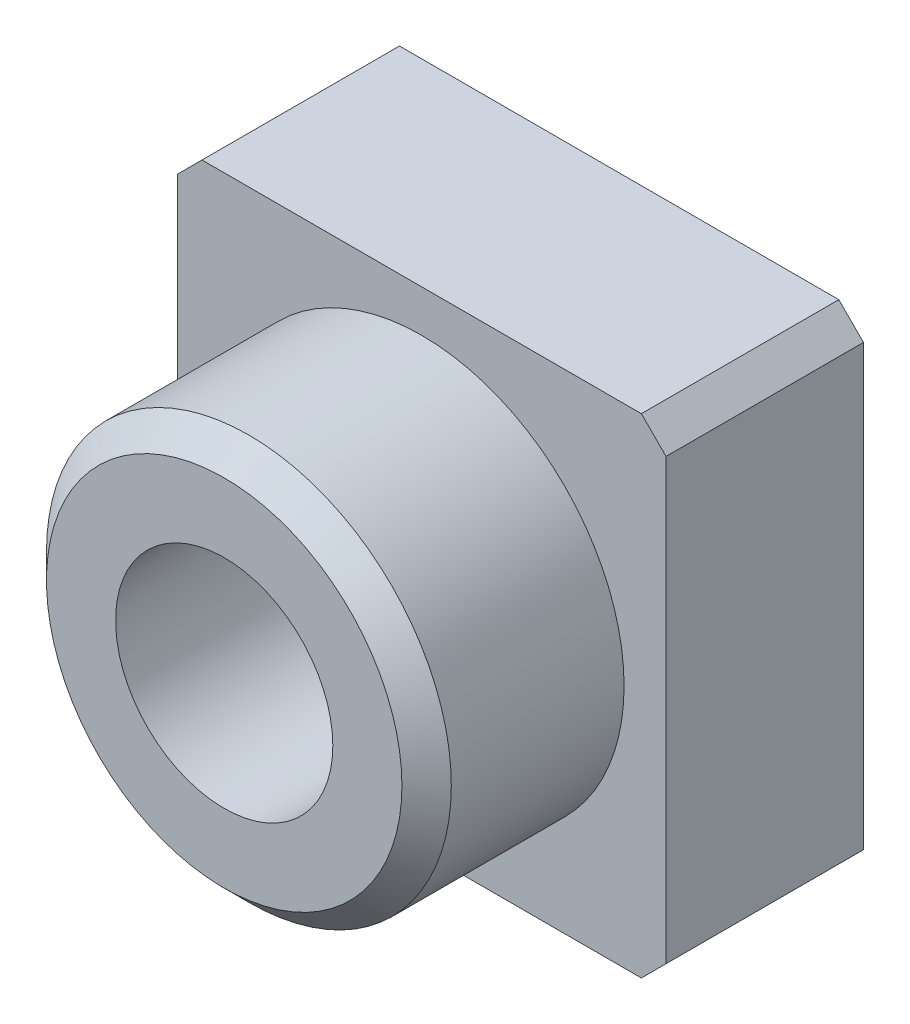
ISO-10303-21;
HEADER;
FILE_DESCRIPTION(('STEP AP214'),'2;1');
FILE_NAME('part.step','',(''),(''),'','','');
FILE_SCHEMA(('AUTOMOTIVE_DESIGN { 1 0 10303 214 1 1 1 1 }'));
ENDSEC;
DATA;
#1=APPLICATION_CONTEXT('core data for automotive mechanical design processes');
#2=APPLICATION_PROTOCOL_DEFINITION('international standard','automotive_design',2000,#1);
#3=PRODUCT_CONTEXT('',#1,'mechanical');
#4=PRODUCT('Part','Part','',(#3));
#5=PRODUCT_RELATED_PRODUCT_CATEGORY('part','',(#4));
#6=PRODUCT_DEFINITION_FORMATION('','',#4);
#7=PRODUCT_DEFINITION_CONTEXT('part definition',#1,'design');
#8=PRODUCT_DEFINITION('design','',#6,#7);
#9=PRODUCT_DEFINITION_SHAPE('','',#8);
#10=(LENGTH_UNIT() NAMED_UNIT(*) SI_UNIT(.MILLI.,.METRE.));
#11=(NAMED_UNIT(*) PLANE_ANGLE_UNIT() SI_UNIT($,.RADIAN.));
#12=(NAMED_UNIT(*) SI_UNIT($,.STERADIAN.) SOLID_ANGLE_UNIT());
#13=UNCERTAINTY_MEASURE_WITH_UNIT(LENGTH_MEASURE(1.E-05),#10,'distance_accuracy_value','');
#14=(GEOMETRIC_REPRESENTATION_CONTEXT(3) GLOBAL_UNCERTAINTY_ASSIGNED_CONTEXT((#13)) GLOBAL_UNIT_ASSIGNED_CONTEXT((#10,
#11,#12)) REPRESENTATION_CONTEXT('',''));
#15=CARTESIAN_POINT('',(0.,0.,0.));
#16=DIRECTION('',(0.,0.,1.));
#17=DIRECTION('',(1.,0.,0.));
#18=AXIS2_PLACEMENT_3D('',#15,#16,#17);
#19=CARTESIAN_POINT('',(0.,0.,0.));
#20=DIRECTION('',(0.,0.,-1.));
#21=DIRECTION('',(-1.,0.,0.));
#22=AXIS2_PLACEMENT_3D('',#19,#20,#21);
#23=PLANE('',#22);
#24=DIRECTION('',(0.,1.,0.));
#25=VECTOR('',#24,1.);
#26=CARTESIAN_POINT('',(4.95,-4.95,0.));
#27=LINE('',#26,#25);
#28=CARTESIAN_POINT('',(4.95,-4.45,0.));
#29=VERTEX_POINT('',#28);
#30=CARTESIAN_POINT('',(4.95,4.44999999999999,0.));
#31=VERTEX_POINT('',#30);
#32=EDGE_CURVE('E231',#29,#31,#27,.T.);
#33=ORIENTED_EDGE('',*,*,#32,.F.);
#34=DIRECTION('',(0.707106781186549,0.707106781186546,0.));
#35=VECTOR('',#34,1.);
#36=CARTESIAN_POINT('',(4.69999999999999,-4.70000000000001,0.));
#37=LINE('',#36,#35);
#38=CARTESIAN_POINT('',(4.44999999999999,-4.95,0.));
#39=VERTEX_POINT('',#38);
#40=EDGE_CURVE('E269',#29,#39,#37,.F.);
#41=ORIENTED_EDGE('',*,*,#40,.T.);
#42=DIRECTION('',(1.,0.,0.));
#43=VECTOR('',#42,1.);
#44=CARTESIAN_POINT('',(-4.95,-4.95,0.));
#45=LINE('',#44,#43);
#46=CARTESIAN_POINT('',(-4.45,-4.95,0.));
#47=VERTEX_POINT('',#46);
#48=EDGE_CURVE('E220',#47,#39,#45,.T.);
#49=ORIENTED_EDGE('',*,*,#48,.F.);
#50=DIRECTION('',(0.707106781186546,-0.707106781186549,0.));
#51=VECTOR('',#50,1.);
#52=CARTESIAN_POINT('',(-4.70000000000001,-4.69999999999999,0.));
#53=LINE('',#52,#51);
#54=CARTESIAN_POINT('',(-4.95,-4.45,0.));
#55=VERTEX_POINT('',#54);
#56=EDGE_CURVE('E263',#47,#55,#53,.F.);
#57=ORIENTED_EDGE('',*,*,#56,.T.);
#58=DIRECTION('',(0.,-1.,0.));
#59=VECTOR('',#58,1.);
#60=CARTESIAN_POINT('',(-4.95,-4.95,0.));
#61=LINE('',#60,#59);
#62=CARTESIAN_POINT('',(-4.95,4.44999999999999,0.));
#63=VERTEX_POINT('',#62);
#64=EDGE_CURVE('E240',#63,#55,#61,.T.);
#65=ORIENTED_EDGE('',*,*,#64,.F.);
#66=DIRECTION('',(-0.707106781186549,-0.707106781186546,0.));
#67=VECTOR('',#66,1.);
#68=CARTESIAN_POINT('',(-4.69999999999999,4.70000000000001,0.));
#69=LINE('',#68,#67);
#70=CARTESIAN_POINT('',(-4.45,4.95,0.));
#71=VERTEX_POINT('',#70);
#72=EDGE_CURVE('E260',#63,#71,#69,.F.);
#73=ORIENTED_EDGE('',*,*,#72,.T.);
#74=DIRECTION('',(-1.,0.,0.));
#75=VECTOR('',#74,1.);
#76=CARTESIAN_POINT('',(-4.95,4.95,0.));
#77=LINE('',#76,#75);
#78=CARTESIAN_POINT('',(4.44999999999999,4.95,0.));
#79=VERTEX_POINT('',#78);
#80=EDGE_CURVE('E235',#79,#71,#77,.T.);
#81=ORIENTED_EDGE('',*,*,#80,.F.);
#82=DIRECTION('',(-0.707106781186546,0.707106781186549,0.));
#83=VECTOR('',#82,1.);
#84=CARTESIAN_POINT('',(4.70000000000001,4.69999999999999,0.));
#85=LINE('',#84,#83);
#86=EDGE_CURVE('E266',#79,#31,#85,.F.);
#87=ORIENTED_EDGE('',*,*,#86,.T.);
#88=EDGE_LOOP('',(#33,#41,#49,#57,#65,#73,#81,#87));
#89=FACE_BOUND('',#88,.T.);
#90=DIRECTION('',(0.5,-0.866025403784439,0.));
#91=VECTOR('',#90,1.);
#92=CARTESIAN_POINT('',(-4.1569219381653,0.,0.));
#93=LINE('',#92,#91);
#94=CARTESIAN_POINT('',(-4.1569219381653,0.,0.));
#95=VERTEX_POINT('',#94);
#96=CARTESIAN_POINT('',(-2.07846096908265,-3.6,0.));
#97=VERTEX_POINT('',#96);
#98=EDGE_CURVE('E192',#95,#97,#93,.T.);
#99=ORIENTED_EDGE('',*,*,#98,.T.);
#100=DIRECTION('',(1.,0.,0.));
#101=VECTOR('',#100,1.);
#102=CARTESIAN_POINT('',(-2.07846096908265,-3.6,0.));
#103=LINE('',#102,#101);
#104=CARTESIAN_POINT('',(2.07846096908265,-3.6,0.));
#105=VERTEX_POINT('',#104);
#106=EDGE_CURVE('E195',#97,#105,#103,.T.);
#107=ORIENTED_EDGE('',*,*,#106,.T.);
#108=DIRECTION('',(0.5,0.866025403784438,0.));
#109=VECTOR('',#108,1.);
#110=CARTESIAN_POINT('',(2.07846096908265,-3.6,0.));
#111=LINE('',#110,#109);
#112=CARTESIAN_POINT('',(4.15692193816531,0.,0.));
#113=VERTEX_POINT('',#112);
#114=EDGE_CURVE('E180',#105,#113,#111,.T.);
#115=ORIENTED_EDGE('',*,*,#114,.T.);
#116=DIRECTION('',(-0.5,0.866025403784438,0.));
#117=VECTOR('',#116,1.);
#118=CARTESIAN_POINT('',(4.15692193816531,0.,0.));
#119=LINE('',#118,#117);
#120=CARTESIAN_POINT('',(2.07846096908265,3.6,0.));
#121=VERTEX_POINT('',#120);
#122=EDGE_CURVE('E156',#113,#121,#119,.T.);
#123=ORIENTED_EDGE('',*,*,#122,.T.);
#124=DIRECTION('',(-1.,0.,0.));
#125=VECTOR('',#124,1.);
#126=CARTESIAN_POINT('',(2.07846096908265,3.6,0.));
#127=LINE('',#126,#125);
#128=CARTESIAN_POINT('',(-2.07846096908265,3.6,0.));
#129=VERTEX_POINT('',#128);
#130=EDGE_CURVE('E167',#121,#129,#127,.T.);
#131=ORIENTED_EDGE('',*,*,#130,.T.);
#132=DIRECTION('',(-0.5,-0.866025403784439,0.));
#133=VECTOR('',#132,1.);
#134=CARTESIAN_POINT('',(-2.07846096908265,3.6,0.));
#135=LINE('',#134,#133);
#136=EDGE_CURVE('E174',#129,#95,#135,.T.);
#137=ORIENTED_EDGE('',*,*,#136,.T.);
#138=EDGE_LOOP('',(#99,#107,#115,#123,#131,#137));
#139=FACE_BOUND('',#138,.T.);
#140=ADVANCED_FACE('F49',(#89,#139),#23,.T.);
#141=CARTESIAN_POINT('',(4.95,-4.95,4.));
#142=DIRECTION('',(-1.,0.,0.));
#143=DIRECTION('',(0.,0.,1.));
#144=AXIS2_PLACEMENT_3D('',#141,#142,#143);
#145=PLANE('',#144);
#146=DIRECTION('',(0.,1.,0.));
#147=VECTOR('',#146,1.);
#148=CARTESIAN_POINT('',(4.95,-4.95,4.));
#149=LINE('',#148,#147);
#150=CARTESIAN_POINT('',(4.95,-4.45,4.));
#151=VERTEX_POINT('',#150);
#152=CARTESIAN_POINT('',(4.95,4.44999999999999,4.));
#153=VERTEX_POINT('',#152);
#154=EDGE_CURVE('E215',#151,#153,#149,.T.);
#155=ORIENTED_EDGE('',*,*,#154,.F.);
#156=DIRECTION('',(0.,0.,-1.));
#157=VECTOR('',#156,1.);
#158=CARTESIAN_POINT('',(4.95,-4.45,4.));
#159=LINE('',#158,#157);
#160=EDGE_CURVE('E256',#151,#29,#159,.T.);
#161=ORIENTED_EDGE('',*,*,#160,.T.);
#162=ORIENTED_EDGE('',*,*,#32,.T.);
#163=DIRECTION('',(0.,0.,1.));
#164=VECTOR('',#163,1.);
#165=CARTESIAN_POINT('',(4.95,4.45,4.));
#166=LINE('',#165,#164);
#167=EDGE_CURVE('E253',#31,#153,#166,.T.);
#168=ORIENTED_EDGE('',*,*,#167,.T.);
#169=EDGE_LOOP('',(#155,#161,#162,#168));
#170=FACE_BOUND('',#169,.T.);
#171=ADVANCED_FACE('F322',(#170),#145,.F.);
#172=CARTESIAN_POINT('',(-4.95,4.95,4.));
#173=DIRECTION('',(0.,-1.,0.));
#174=DIRECTION('',(0.,0.,-1.));
#175=AXIS2_PLACEMENT_3D('',#172,#173,#174);
#176=PLANE('',#175);
#177=DIRECTION('',(-1.,0.,0.));
#178=VECTOR('',#177,1.);
#179=CARTESIAN_POINT('',(-4.95,4.95,4.));
#180=LINE('',#179,#178);
#181=CARTESIAN_POINT('',(4.44999999999999,4.95,4.));
#182=VERTEX_POINT('',#181);
#183=CARTESIAN_POINT('',(-4.45,4.95,4.));
#184=VERTEX_POINT('',#183);
#185=EDGE_CURVE('E219',#182,#184,#180,.T.);
#186=ORIENTED_EDGE('',*,*,#185,.F.);
#187=DIRECTION('',(0.,0.,-1.));
#188=VECTOR('',#187,1.);
#189=CARTESIAN_POINT('',(4.45,4.95,4.));
#190=LINE('',#189,#188);
#191=EDGE_CURVE('E293',#182,#79,#190,.T.);
#192=ORIENTED_EDGE('',*,*,#191,.T.);
#193=ORIENTED_EDGE('',*,*,#80,.T.);
#194=DIRECTION('',(0.,0.,1.));
#195=VECTOR('',#194,1.);
#196=CARTESIAN_POINT('',(-4.45,4.95,4.));
#197=LINE('',#196,#195);
#198=EDGE_CURVE('E290',#71,#184,#197,.T.);
#199=ORIENTED_EDGE('',*,*,#198,.T.);
#200=EDGE_LOOP('',(#186,#192,#193,#199));
#201=FACE_BOUND('',#200,.T.);
#202=ADVANCED_FACE('F330',(#201),#176,.F.);
#203=CARTESIAN_POINT('',(-4.95,-4.95,4.));
#204=DIRECTION('',(1.,0.,0.));
#205=DIRECTION('',(0.,0.,-1.));
#206=AXIS2_PLACEMENT_3D('',#203,#204,#205);
#207=PLANE('',#206);
#208=ORIENTED_EDGE('',*,*,#64,.T.);
#209=DIRECTION('',(0.,0.,1.));
#210=VECTOR('',#209,1.);
#211=CARTESIAN_POINT('',(-4.95,-4.45,4.));
#212=LINE('',#211,#210);
#213=CARTESIAN_POINT('',(-4.95,-4.45,4.));
#214=VERTEX_POINT('',#213);
#215=EDGE_CURVE('E12',#55,#214,#212,.T.);
#216=ORIENTED_EDGE('',*,*,#215,.T.);
#217=DIRECTION('',(0.,-1.,0.));
#218=VECTOR('',#217,1.);
#219=CARTESIAN_POINT('',(-4.95,-4.95,4.));
#220=LINE('',#219,#218);
#221=CARTESIAN_POINT('',(-4.95,4.44999999999999,4.));
#222=VERTEX_POINT('',#221);
#223=EDGE_CURVE('E223',#222,#214,#220,.T.);
#224=ORIENTED_EDGE('',*,*,#223,.F.);
#225=DIRECTION('',(0.,0.,-1.));
#226=VECTOR('',#225,1.);
#227=CARTESIAN_POINT('',(-4.95,4.45,4.));
#228=LINE('',#227,#226);
#229=EDGE_CURVE('E59',#222,#63,#228,.T.);
#230=ORIENTED_EDGE('',*,*,#229,.T.);
#231=EDGE_LOOP('',(#208,#216,#224,#230));
#232=FACE_BOUND('',#231,.T.);
#233=ADVANCED_FACE('F301',(#232),#207,.F.);
#234=CARTESIAN_POINT('',(-4.95,-4.95,4.));
#235=DIRECTION('',(0.,1.,0.));
#236=DIRECTION('',(0.,0.,1.));
#237=AXIS2_PLACEMENT_3D('',#234,#235,#236);
#238=PLANE('',#237);
#239=ORIENTED_EDGE('',*,*,#48,.T.);
#240=DIRECTION('',(0.,0.,1.));
#241=VECTOR('',#240,1.);
#242=CARTESIAN_POINT('',(4.45,-4.95,4.));
#243=LINE('',#242,#241);
#244=CARTESIAN_POINT('',(4.44999999999999,-4.95,4.));
#245=VERTEX_POINT('',#244);
#246=EDGE_CURVE('E276',#39,#245,#243,.T.);
#247=ORIENTED_EDGE('',*,*,#246,.T.);
#248=DIRECTION('',(1.,0.,0.));
#249=VECTOR('',#248,1.);
#250=CARTESIAN_POINT('',(-4.95,-4.95,4.));
#251=LINE('',#250,#249);
#252=CARTESIAN_POINT('',(-4.45,-4.95,4.));
#253=VERTEX_POINT('',#252);
#254=EDGE_CURVE('E226',#253,#245,#251,.T.);
#255=ORIENTED_EDGE('',*,*,#254,.F.);
#256=DIRECTION('',(0.,0.,-1.));
#257=VECTOR('',#256,1.);
#258=CARTESIAN_POINT('',(-4.45,-4.95,4.));
#259=LINE('',#258,#257);
#260=EDGE_CURVE('E272',#253,#47,#259,.T.);
#261=ORIENTED_EDGE('',*,*,#260,.T.);
#262=EDGE_LOOP('',(#239,#247,#255,#261));
#263=FACE_BOUND('',#262,.T.);
#264=ADVANCED_FACE('F313',(#263),#238,.F.);
#265=CARTESIAN_POINT('',(0.,0.,4.));
#266=DIRECTION('',(0.,0.,-1.));
#267=DIRECTION('',(-1.,0.,0.));
#268=AXIS2_PLACEMENT_3D('',#265,#266,#267);
#269=PLANE('',#268);
#270=CARTESIAN_POINT('',(0.,0.,4.));
#271=DIRECTION('',(0.,0.,1.));
#272=DIRECTION('',(1.,0.,0.));
#273=AXIS2_PLACEMENT_3D('',#270,#271,#272);
#274=CIRCLE('',#273,4.1);
#275=CARTESIAN_POINT('',(4.1,0.,4.));
#276=VERTEX_POINT('',#275);
#277=EDGE_CURVE('E230',#276,#276,#274,.T.);
#278=ORIENTED_EDGE('',*,*,#277,.F.);
#279=EDGE_LOOP('',(#278));
#280=FACE_BOUND('',#279,.T.);
#281=ORIENTED_EDGE('',*,*,#254,.T.);
#282=DIRECTION('',(-0.707106781186549,-0.707106781186546,0.));
#283=VECTOR('',#282,1.);
#284=CARTESIAN_POINT('',(4.95,-4.45,4.));
#285=LINE('',#284,#283);
#286=EDGE_CURVE('E287',#245,#151,#285,.F.);
#287=ORIENTED_EDGE('',*,*,#286,.T.);
#288=ORIENTED_EDGE('',*,*,#154,.T.);
#289=DIRECTION('',(0.707106781186546,-0.707106781186549,0.));
#290=VECTOR('',#289,1.);
#291=CARTESIAN_POINT('',(4.45,4.95,4.));
#292=LINE('',#291,#290);
#293=EDGE_CURVE('E284',#153,#182,#292,.F.);
#294=ORIENTED_EDGE('',*,*,#293,.T.);
#295=ORIENTED_EDGE('',*,*,#185,.T.);
#296=DIRECTION('',(0.707106781186549,0.707106781186546,0.));
#297=VECTOR('',#296,1.);
#298=CARTESIAN_POINT('',(-4.95,4.45,4.));
#299=LINE('',#298,#297);
#300=EDGE_CURVE('E71',#184,#222,#299,.F.);
#301=ORIENTED_EDGE('',*,*,#300,.T.);
#302=ORIENTED_EDGE('',*,*,#223,.T.);
#303=DIRECTION('',(-0.707106781186546,0.707106781186549,0.));
#304=VECTOR('',#303,1.);
#305=CARTESIAN_POINT('',(-4.45,-4.95,4.));
#306=LINE('',#305,#304);
#307=EDGE_CURVE('E281',#214,#253,#306,.F.);
#308=ORIENTED_EDGE('',*,*,#307,.T.);
#309=EDGE_LOOP('',(#281,#287,#288,#294,#295,#301,#302,#308));
#310=FACE_BOUND('',#309,.T.);
#311=ADVANCED_FACE('F316',(#280,#310),#269,.F.);
#312=CARTESIAN_POINT('',(-2.07846096908265,-3.6,14.998181667894));
#313=DIRECTION('',(0.,1.,0.));
#314=DIRECTION('',(0.,0.,1.));
#315=AXIS2_PLACEMENT_3D('',#312,#313,#314);
#316=PLANE('',#315);
#317=DIRECTION('',(0.,0.,-1.));
#318=VECTOR('',#317,1.);
#319=CARTESIAN_POINT('',(2.07846096908265,-3.6,14.998181667894));
#320=LINE('',#319,#318);
#321=CARTESIAN_POINT('',(2.07846096908265,-3.6,3.2));
#322=VERTEX_POINT('',#321);
#323=EDGE_CURVE('E198',#322,#105,#320,.T.);
#324=ORIENTED_EDGE('',*,*,#323,.T.);
#325=ORIENTED_EDGE('',*,*,#106,.F.);
#326=DIRECTION('',(0.,0.,-1.));
#327=VECTOR('',#326,1.);
#328=CARTESIAN_POINT('',(-2.07846096908265,-3.6,14.998181667894));
#329=LINE('',#328,#327);
#330=CARTESIAN_POINT('',(-2.07846096908265,-3.6,3.2));
#331=VERTEX_POINT('',#330);
#332=EDGE_CURVE('E201',#331,#97,#329,.T.);
#333=ORIENTED_EDGE('',*,*,#332,.F.);
#334=DIRECTION('',(-1.,0.,0.));
#335=VECTOR('',#334,1.);
#336=CARTESIAN_POINT('',(-2.07846096908265,-3.6,3.2));
#337=LINE('',#336,#335);
#338=EDGE_CURVE('E210',#322,#331,#337,.T.);
#339=ORIENTED_EDGE('',*,*,#338,.F.);
#340=EDGE_LOOP('',(#324,#325,#333,#339));
#341=FACE_BOUND('',#340,.T.);
#342=ADVANCED_FACE('F483',(#341),#316,.T.);
#343=CARTESIAN_POINT('',(-4.1569219381653,0.,14.998181667894));
#344=DIRECTION('',(0.866025403784439,0.5,0.));
#345=DIRECTION('',(-0.5,0.866025403784439,0.));
#346=AXIS2_PLACEMENT_3D('',#343,#344,#345);
#347=PLANE('',#346);
#348=ORIENTED_EDGE('',*,*,#332,.T.);
#349=ORIENTED_EDGE('',*,*,#98,.F.);
#350=DIRECTION('',(0.,0.,-1.));
#351=VECTOR('',#350,1.);
#352=CARTESIAN_POINT('',(-4.1569219381653,0.,14.998181667894));
#353=LINE('',#352,#351);
#354=CARTESIAN_POINT('',(-4.1569219381653,0.,3.2));
#355=VERTEX_POINT('',#354);
#356=EDGE_CURVE('E204',#355,#95,#353,.T.);
#357=ORIENTED_EDGE('',*,*,#356,.F.);
#358=DIRECTION('',(-0.5,0.866025403784439,0.));
#359=VECTOR('',#358,1.);
#360=CARTESIAN_POINT('',(-4.1569219381653,0.,3.2));
#361=LINE('',#360,#359);
#362=EDGE_CURVE('E214',#331,#355,#361,.T.);
#363=ORIENTED_EDGE('',*,*,#362,.F.);
#364=EDGE_LOOP('',(#348,#349,#357,#363));
#365=FACE_BOUND('',#364,.T.);
#366=ADVANCED_FACE('F473',(#365),#347,.T.);
#367=CARTESIAN_POINT('',(-2.07846096908265,3.6,14.998181667894));
#368=DIRECTION('',(0.866025403784439,-0.5,0.));
#369=DIRECTION('',(0.5,0.866025403784439,0.));
#370=AXIS2_PLACEMENT_3D('',#367,#368,#369);
#371=PLANE('',#370);
#372=ORIENTED_EDGE('',*,*,#356,.T.);
#373=ORIENTED_EDGE('',*,*,#136,.F.);
#374=DIRECTION('',(0.,0.,-1.));
#375=VECTOR('',#374,1.);
#376=CARTESIAN_POINT('',(-2.07846096908265,3.6,14.998181667894));
#377=LINE('',#376,#375);
#378=CARTESIAN_POINT('',(-2.07846096908265,3.6,3.2));
#379=VERTEX_POINT('',#378);
#380=EDGE_CURVE('E164',#379,#129,#377,.T.);
#381=ORIENTED_EDGE('',*,*,#380,.F.);
#382=DIRECTION('',(0.5,0.866025403784439,0.));
#383=VECTOR('',#382,1.);
#384=CARTESIAN_POINT('',(-2.07846096908265,3.6,3.2));
#385=LINE('',#384,#383);
#386=EDGE_CURVE('E564',#355,#379,#385,.T.);
#387=ORIENTED_EDGE('',*,*,#386,.F.);
#388=EDGE_LOOP('',(#372,#373,#381,#387));
#389=FACE_BOUND('',#388,.T.);
#390=ADVANCED_FACE('F464',(#389),#371,.T.);
#391=CARTESIAN_POINT('',(2.07846096908265,3.6,14.998181667894));
#392=DIRECTION('',(0.,-1.,0.));
#393=DIRECTION('',(1.,0.,0.));
#394=AXIS2_PLACEMENT_3D('',#391,#392,#393);
#395=PLANE('',#394);
#396=ORIENTED_EDGE('',*,*,#380,.T.);
#397=ORIENTED_EDGE('',*,*,#130,.F.);
#398=DIRECTION('',(0.,0.,-1.));
#399=VECTOR('',#398,1.);
#400=CARTESIAN_POINT('',(2.07846096908265,3.6,14.998181667894));
#401=LINE('',#400,#399);
#402=CARTESIAN_POINT('',(2.07846096908265,3.6,3.2));
#403=VERTEX_POINT('',#402);
#404=EDGE_CURVE('E151',#403,#121,#401,.T.);
#405=ORIENTED_EDGE('',*,*,#404,.F.);
#406=DIRECTION('',(1.,0.,0.));
#407=VECTOR('',#406,1.);
#408=CARTESIAN_POINT('',(2.07846096908265,3.6,3.2));
#409=LINE('',#408,#407);
#410=EDGE_CURVE('E568',#379,#403,#409,.T.);
#411=ORIENTED_EDGE('',*,*,#410,.F.);
#412=EDGE_LOOP('',(#396,#397,#405,#411));
#413=FACE_BOUND('',#412,.T.);
#414=ADVANCED_FACE('F168',(#413),#395,.T.);
#415=CARTESIAN_POINT('',(4.15692193816531,0.,14.998181667894));
#416=DIRECTION('',(-0.866025403784438,-0.5,0.));
#417=DIRECTION('',(0.5,-0.866025403784438,0.));
#418=AXIS2_PLACEMENT_3D('',#415,#416,#417);
#419=PLANE('',#418);
#420=ORIENTED_EDGE('',*,*,#404,.T.);
#421=ORIENTED_EDGE('',*,*,#122,.F.);
#422=DIRECTION('',(0.,0.,-1.));
#423=VECTOR('',#422,1.);
#424=CARTESIAN_POINT('',(4.15692193816531,0.,14.998181667894));
#425=LINE('',#424,#423);
#426=CARTESIAN_POINT('',(4.15692193816531,0.,3.2));
#427=VERTEX_POINT('',#426);
#428=EDGE_CURVE('E163',#427,#113,#425,.T.);
#429=ORIENTED_EDGE('',*,*,#428,.F.);
#430=DIRECTION('',(0.5,-0.866025403784438,0.));
#431=VECTOR('',#430,1.);
#432=CARTESIAN_POINT('',(4.15692193816531,0.,3.2));
#433=LINE('',#432,#431);
#434=EDGE_CURVE('E159',#403,#427,#433,.T.);
#435=ORIENTED_EDGE('',*,*,#434,.F.);
#436=EDGE_LOOP('',(#420,#421,#429,#435));
#437=FACE_BOUND('',#436,.T.);
#438=ADVANCED_FACE('F153',(#437),#419,.T.);
#439=CARTESIAN_POINT('',(2.07846096908265,-3.6,14.998181667894));
#440=DIRECTION('',(-0.866025403784439,0.5,0.));
#441=DIRECTION('',(-0.5,-0.866025403784439,0.));
#442=AXIS2_PLACEMENT_3D('',#439,#440,#441);
#443=PLANE('',#442);
#444=ORIENTED_EDGE('',*,*,#428,.T.);
#445=ORIENTED_EDGE('',*,*,#114,.F.);
#446=ORIENTED_EDGE('',*,*,#323,.F.);
#447=DIRECTION('',(-0.5,-0.866025403784439,0.));
#448=VECTOR('',#447,1.);
#449=CARTESIAN_POINT('',(2.07846096908265,-3.6,3.2));
#450=LINE('',#449,#448);
#451=EDGE_CURVE('E236',#427,#322,#450,.T.);
#452=ORIENTED_EDGE('',*,*,#451,.F.);
#453=EDGE_LOOP('',(#444,#445,#446,#452));
#454=FACE_BOUND('',#453,.T.);
#455=ADVANCED_FACE('F438',(#454),#443,.T.);
#456=CARTESIAN_POINT('',(0.,0.,3.2));
#457=DIRECTION('',(0.,0.,-1.));
#458=DIRECTION('',(-1.,0.,0.));
#459=AXIS2_PLACEMENT_3D('',#456,#457,#458);
#460=PLANE('',#459);
#461=CARTESIAN_POINT('',(0.,0.,3.2));
#462=DIRECTION('',(0.,0.,-1.));
#463=DIRECTION('',(-1.,0.,0.));
#464=AXIS2_PLACEMENT_3D('',#461,#462,#463);
#465=CIRCLE('',#464,2.2);
#466=CARTESIAN_POINT('',(-2.2,0.,3.2));
#467=VERTEX_POINT('',#466);
#468=EDGE_CURVE('E186',#467,#467,#465,.T.);
#469=ORIENTED_EDGE('',*,*,#468,.F.);
#470=EDGE_LOOP('',(#469));
#471=FACE_BOUND('',#470,.T.);
#472=ORIENTED_EDGE('',*,*,#434,.T.);
#473=ORIENTED_EDGE('',*,*,#451,.T.);
#474=ORIENTED_EDGE('',*,*,#338,.T.);
#475=ORIENTED_EDGE('',*,*,#362,.T.);
#476=ORIENTED_EDGE('',*,*,#386,.T.);
#477=ORIENTED_EDGE('',*,*,#410,.T.);
#478=EDGE_LOOP('',(#472,#473,#474,#475,#476,#477));
#479=FACE_BOUND('',#478,.T.);
#480=ADVANCED_FACE('F428',(#471,#479),#460,.T.);
#481=CARTESIAN_POINT('',(0.,0.,8.));
#482=DIRECTION('',(0.,0.,-1.));
#483=DIRECTION('',(-1.,0.,0.));
#484=AXIS2_PLACEMENT_3D('',#481,#482,#483);
#485=CYLINDRICAL_SURFACE('',#484,4.1);
#486=CARTESIAN_POINT('',(0.,0.,7.49999999999999));
#487=DIRECTION('',(0.,0.,1.));
#488=DIRECTION('',(1.,0.,0.));
#489=AXIS2_PLACEMENT_3D('',#486,#487,#488);
#490=CIRCLE('',#489,4.1);
#491=CARTESIAN_POINT('',(4.1,0.,7.49999999999999));
#492=VERTEX_POINT('',#491);
#493=EDGE_CURVE('E249',#492,#492,#490,.F.);
#494=ORIENTED_EDGE('',*,*,#493,.T.);
#495=EDGE_LOOP('',(#494));
#496=FACE_BOUND('',#495,.T.);
#497=ORIENTED_EDGE('',*,*,#277,.T.);
#498=EDGE_LOOP('',(#497));
#499=FACE_BOUND('',#498,.T.);
#500=ADVANCED_FACE('F418',(#496,#499),#485,.T.);
#501=CARTESIAN_POINT('',(0.,0.,8.));
#502=DIRECTION('',(0.,0.,1.));
#503=DIRECTION('',(1.,0.,0.));
#504=AXIS2_PLACEMENT_3D('',#501,#502,#503);
#505=PLANE('',#504);
#506=CARTESIAN_POINT('',(0.,0.,8.));
#507=DIRECTION('',(0.,0.,1.));
#508=DIRECTION('',(1.,0.,0.));
#509=AXIS2_PLACEMENT_3D('',#506,#507,#508);
#510=CIRCLE('',#509,2.2);
#511=CARTESIAN_POINT('',(2.2,0.,8.));
#512=VERTEX_POINT('',#511);
#513=EDGE_CURVE('E579',#512,#512,#510,.T.);
#514=ORIENTED_EDGE('',*,*,#513,.F.);
#515=EDGE_LOOP('',(#514));
#516=FACE_BOUND('',#515,.T.);
#517=CARTESIAN_POINT('',(0.,0.,8.));
#518=DIRECTION('',(0.,0.,1.));
#519=DIRECTION('',(1.,0.,0.));
#520=AXIS2_PLACEMENT_3D('',#517,#518,#519);
#521=CIRCLE('',#520,3.59999999999999);
#522=CARTESIAN_POINT('',(3.59999999999999,0.,8.));
#523=VERTEX_POINT('',#522);
#524=EDGE_CURVE('E245',#523,#523,#521,.T.);
#525=ORIENTED_EDGE('',*,*,#524,.T.);
#526=EDGE_LOOP('',(#525));
#527=FACE_BOUND('',#526,.T.);
#528=ADVANCED_FACE('F357',(#516,#527),#505,.T.);
#529=CARTESIAN_POINT('',(0.,0.,8.));
#530=DIRECTION('',(0.,0.,-1.));
#531=DIRECTION('',(-1.,0.,0.));
#532=AXIS2_PLACEMENT_3D('',#529,#530,#531);
#533=CONICAL_SURFACE('',#532,3.59999999999999,0.785398163397447);
#534=ORIENTED_EDGE('',*,*,#493,.F.);
#535=EDGE_LOOP('',(#534));
#536=FACE_BOUND('',#535,.T.);
#537=ORIENTED_EDGE('',*,*,#524,.F.);
#538=EDGE_LOOP('',(#537));
#539=FACE_BOUND('',#538,.T.);
#540=ADVANCED_FACE('F350',(#536,#539),#533,.T.);
#541=CARTESIAN_POINT('',(0.,0.,0.));
#542=DIRECTION('',(0.,0.,1.));
#543=DIRECTION('',(1.,0.,0.));
#544=AXIS2_PLACEMENT_3D('',#541,#542,#543);
#545=CYLINDRICAL_SURFACE('',#544,2.2);
#546=ORIENTED_EDGE('',*,*,#468,.T.);
#547=EDGE_LOOP('',(#546));
#548=FACE_BOUND('',#547,.T.);
#549=ORIENTED_EDGE('',*,*,#513,.T.);
#550=EDGE_LOOP('',(#549));
#551=FACE_BOUND('',#550,.T.);
#552=ADVANCED_FACE('F356',(#548,#551),#545,.F.);
#553=CARTESIAN_POINT('',(4.95,-4.45,4.));
#554=DIRECTION('',(-0.707106781186546,0.707106781186549,0.));
#555=DIRECTION('',(0.,0.,-1.));
#556=AXIS2_PLACEMENT_3D('',#553,#554,#555);
#557=PLANE('',#556);
#558=ORIENTED_EDGE('',*,*,#286,.F.);
#559=ORIENTED_EDGE('',*,*,#246,.F.);
#560=ORIENTED_EDGE('',*,*,#40,.F.);
#561=ORIENTED_EDGE('',*,*,#160,.F.);
#562=EDGE_LOOP('',(#558,#559,#560,#561));
#563=FACE_BOUND('',#562,.T.);
#564=ADVANCED_FACE('F320',(#563),#557,.F.);
#565=CARTESIAN_POINT('',(4.45,4.95,4.));
#566=DIRECTION('',(-0.707106781186549,-0.707106781186546,0.));
#567=DIRECTION('',(0.,0.,-1.));
#568=AXIS2_PLACEMENT_3D('',#565,#566,#567);
#569=PLANE('',#568);
#570=ORIENTED_EDGE('',*,*,#293,.F.);
#571=ORIENTED_EDGE('',*,*,#167,.F.);
#572=ORIENTED_EDGE('',*,*,#86,.F.);
#573=ORIENTED_EDGE('',*,*,#191,.F.);
#574=EDGE_LOOP('',(#570,#571,#572,#573));
#575=FACE_BOUND('',#574,.T.);
#576=ADVANCED_FACE('F327',(#575),#569,.F.);
#577=CARTESIAN_POINT('',(-4.45,-4.95,4.));
#578=DIRECTION('',(0.707106781186549,0.707106781186546,0.));
#579=DIRECTION('',(0.,0.,-1.));
#580=AXIS2_PLACEMENT_3D('',#577,#578,#579);
#581=PLANE('',#580);
#582=ORIENTED_EDGE('',*,*,#307,.F.);
#583=ORIENTED_EDGE('',*,*,#215,.F.);
#584=ORIENTED_EDGE('',*,*,#56,.F.);
#585=ORIENTED_EDGE('',*,*,#260,.F.);
#586=EDGE_LOOP('',(#582,#583,#584,#585));
#587=FACE_BOUND('',#586,.T.);
#588=ADVANCED_FACE('F310',(#587),#581,.F.);
#589=CARTESIAN_POINT('',(-4.95,4.45,4.));
#590=DIRECTION('',(0.707106781186546,-0.707106781186549,0.));
#591=DIRECTION('',(0.,0.,-1.));
#592=AXIS2_PLACEMENT_3D('',#589,#590,#591);
#593=PLANE('',#592);
#594=ORIENTED_EDGE('',*,*,#300,.F.);
#595=ORIENTED_EDGE('',*,*,#198,.F.);
#596=ORIENTED_EDGE('',*,*,#72,.F.);
#597=ORIENTED_EDGE('',*,*,#229,.F.);
#598=EDGE_LOOP('',(#594,#595,#596,#597));
#599=FACE_BOUND('',#598,.T.);
#600=ADVANCED_FACE('F52',(#599),#593,.F.);
#601=CLOSED_SHELL('',(#140,#171,#202,#233,#264,#311,#342,#366,#390,#414,#438,#455,#480,#500,
#528,#540,#552,#564,#576,#588,#600));
#602=MANIFOLD_SOLID_BREP('B2',#601);
#603=ADVANCED_BREP_SHAPE_REPRESENTATION('',(#18,#602),#14);
#604=SHAPE_DEFINITION_REPRESENTATION(#9,#603);
ENDSEC;
END-ISO-10303-21;
